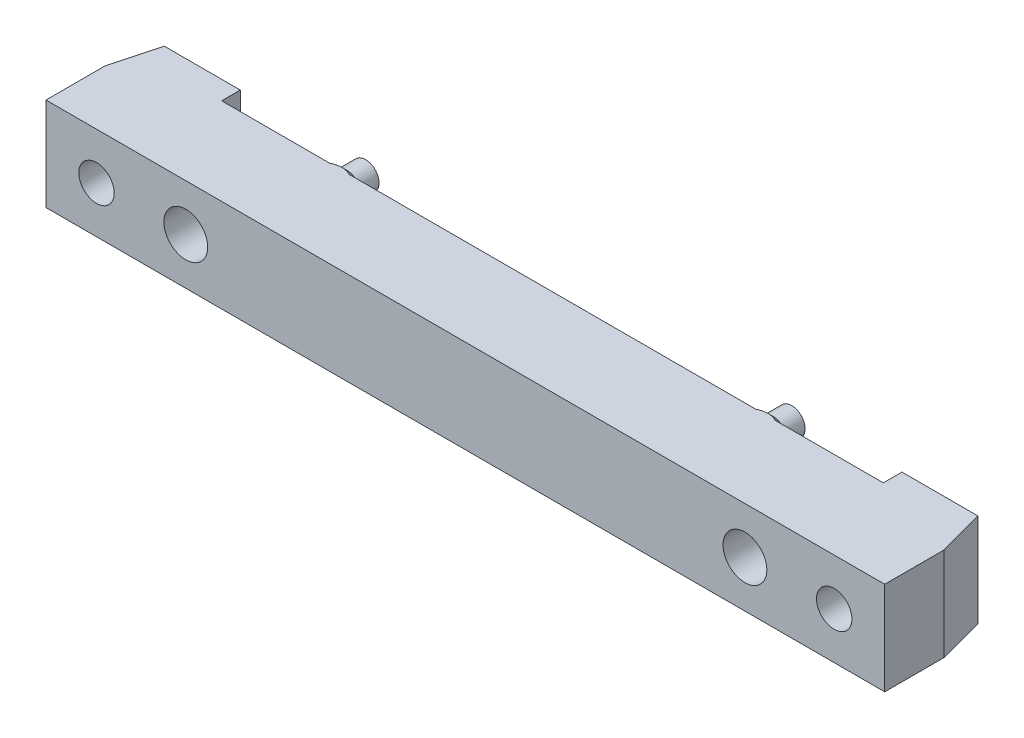
ISO-10303-21;
HEADER;
FILE_DESCRIPTION(('STEP AP214'),'2;1');
FILE_NAME('part.step','',(''),(''),'','','');
FILE_SCHEMA(('AUTOMOTIVE_DESIGN { 1 0 10303 214 1 1 1 1 }'));
ENDSEC;
DATA;
#1=APPLICATION_CONTEXT('core data for automotive mechanical design processes');
#2=APPLICATION_PROTOCOL_DEFINITION('international standard','automotive_design',2000,#1);
#3=PRODUCT_CONTEXT('',#1,'mechanical');
#4=PRODUCT('Part','Part','',(#3));
#5=PRODUCT_RELATED_PRODUCT_CATEGORY('part','',(#4));
#6=PRODUCT_DEFINITION_FORMATION('','',#4);
#7=PRODUCT_DEFINITION_CONTEXT('part definition',#1,'design');
#8=PRODUCT_DEFINITION('design','',#6,#7);
#9=PRODUCT_DEFINITION_SHAPE('','',#8);
#10=(LENGTH_UNIT() NAMED_UNIT(*) SI_UNIT(.MILLI.,.METRE.));
#11=(NAMED_UNIT(*) PLANE_ANGLE_UNIT() SI_UNIT($,.RADIAN.));
#12=(NAMED_UNIT(*) SI_UNIT($,.STERADIAN.) SOLID_ANGLE_UNIT());
#13=UNCERTAINTY_MEASURE_WITH_UNIT(LENGTH_MEASURE(1.E-05),#10,'distance_accuracy_value','');
#14=(GEOMETRIC_REPRESENTATION_CONTEXT(3) GLOBAL_UNCERTAINTY_ASSIGNED_CONTEXT((#13)) GLOBAL_UNIT_ASSIGNED_CONTEXT((#10,
#11,#12)) REPRESENTATION_CONTEXT('',''));
#15=CARTESIAN_POINT('',(0.,0.,0.));
#16=DIRECTION('',(0.,0.,1.));
#17=DIRECTION('',(1.,0.,0.));
#18=AXIS2_PLACEMENT_3D('',#15,#16,#17);
#19=CARTESIAN_POINT('',(0.,0.,0.));
#20=DIRECTION('',(0.,0.,1.));
#21=DIRECTION('',(1.,0.,0.));
#22=AXIS2_PLACEMENT_3D('',#19,#20,#21);
#23=PLANE('',#22);
#24=CARTESIAN_POINT('',(75.,5.,0.));
#25=DIRECTION('',(0.,0.,1.));
#26=DIRECTION('',(1.,0.,0.));
#27=AXIS2_PLACEMENT_3D('',#24,#25,#26);
#28=CIRCLE('',#27,1.89864999999999);
#29=CARTESIAN_POINT('',(76.89865,5.,0.));
#30=VERTEX_POINT('',#29);
#31=EDGE_CURVE('E333',#30,#30,#28,.T.);
#32=ORIENTED_EDGE('',*,*,#31,.T.);
#33=EDGE_LOOP('',(#32));
#34=FACE_BOUND('',#33,.T.);
#35=CARTESIAN_POINT('',(15.,5.,0.));
#36=DIRECTION('',(0.,0.,1.));
#37=DIRECTION('',(1.,0.,0.));
#38=AXIS2_PLACEMENT_3D('',#35,#36,#37);
#39=CIRCLE('',#38,1.89864999999999);
#40=CARTESIAN_POINT('',(16.89865,5.,0.));
#41=VERTEX_POINT('',#40);
#42=EDGE_CURVE('E337',#41,#41,#39,.T.);
#43=ORIENTED_EDGE('',*,*,#42,.T.);
#44=EDGE_LOOP('',(#43));
#45=FACE_BOUND('',#44,.T.);
#46=DIRECTION('',(-1.,0.,0.));
#47=VECTOR('',#46,1.);
#48=CARTESIAN_POINT('',(0.,10.,0.));
#49=LINE('',#48,#47);
#50=CARTESIAN_POINT('',(21.0843218674473,10.,0.));
#51=VERTEX_POINT('',#50);
#52=CARTESIAN_POINT('',(9.49999999999999,10.,0.));
#53=VERTEX_POINT('',#52);
#54=EDGE_CURVE('E157',#51,#53,#49,.T.);
#55=ORIENTED_EDGE('',*,*,#54,.F.);
#56=CARTESIAN_POINT('',(22.1434063877496,8.01484509953101,0.));
#57=DIRECTION('',(0.,0.,1.));
#58=DIRECTION('',(1.,0.,0.));
#59=AXIS2_PLACEMENT_3D('',#56,#57,#58);
#60=CIRCLE('',#59,2.24999999999997);
#61=CARTESIAN_POINT('',(23.2024909080518,10.,0.));
#62=VERTEX_POINT('',#61);
#63=EDGE_CURVE('E184',#51,#62,#60,.T.);
#64=ORIENTED_EDGE('',*,*,#63,.T.);
#65=CARTESIAN_POINT('',(66.8043218674473,10.,0.));
#66=VERTEX_POINT('',#65);
#67=EDGE_CURVE('E160',#66,#62,#49,.T.);
#68=ORIENTED_EDGE('',*,*,#67,.F.);
#69=CARTESIAN_POINT('',(67.8634063877496,8.01484509953101,0.));
#70=DIRECTION('',(0.,0.,1.));
#71=DIRECTION('',(1.,0.,0.));
#72=AXIS2_PLACEMENT_3D('',#69,#70,#71);
#73=CIRCLE('',#72,2.25);
#74=CARTESIAN_POINT('',(68.9224909080519,10.,0.));
#75=VERTEX_POINT('',#74);
#76=EDGE_CURVE('E182',#66,#75,#73,.T.);
#77=ORIENTED_EDGE('',*,*,#76,.T.);
#78=CARTESIAN_POINT('',(80.5,10.,0.));
#79=VERTEX_POINT('',#78);
#80=EDGE_CURVE('E147',#79,#75,#49,.T.);
#81=ORIENTED_EDGE('',*,*,#80,.F.);
#82=DIRECTION('',(0.,1.,0.));
#83=VECTOR('',#82,1.);
#84=CARTESIAN_POINT('',(80.5,10.,0.));
#85=LINE('',#84,#83);
#86=CARTESIAN_POINT('',(80.5,0.,0.));
#87=VERTEX_POINT('',#86);
#88=EDGE_CURVE('E133',#87,#79,#85,.T.);
#89=ORIENTED_EDGE('',*,*,#88,.F.);
#90=DIRECTION('',(1.,0.,0.));
#91=VECTOR('',#90,1.);
#92=CARTESIAN_POINT('',(0.,0.,0.));
#93=LINE('',#92,#91);
#94=CARTESIAN_POINT('',(9.49999999999999,0.,0.));
#95=VERTEX_POINT('',#94);
#96=EDGE_CURVE('E143',#95,#87,#93,.T.);
#97=ORIENTED_EDGE('',*,*,#96,.F.);
#98=DIRECTION('',(0.,-1.,0.));
#99=VECTOR('',#98,1.);
#100=CARTESIAN_POINT('',(9.49999999999999,10.,0.));
#101=LINE('',#100,#99);
#102=EDGE_CURVE('E148',#53,#95,#101,.T.);
#103=ORIENTED_EDGE('',*,*,#102,.F.);
#104=EDGE_LOOP('',(#55,#64,#68,#77,#81,#89,#97,#103));
#105=FACE_BOUND('',#104,.T.);
#106=ADVANCED_FACE('F38',(#34,#45,#105),#23,.F.);
#107=CARTESIAN_POINT('',(0.,10.,9.35));
#108=DIRECTION('',(1.,0.,0.));
#109=DIRECTION('',(0.,0.,-1.));
#110=AXIS2_PLACEMENT_3D('',#107,#108,#109);
#111=PLANE('',#110);
#112=DIRECTION('',(0.,0.,-1.));
#113=VECTOR('',#112,1.);
#114=CARTESIAN_POINT('',(0.,10.,9.35));
#115=LINE('',#114,#113);
#116=CARTESIAN_POINT('',(0.,10.,9.35));
#117=VERTEX_POINT('',#116);
#118=CARTESIAN_POINT('',(0.,10.,3.00000000000006));
#119=VERTEX_POINT('',#118);
#120=EDGE_CURVE('E169',#117,#119,#115,.T.);
#121=ORIENTED_EDGE('',*,*,#120,.T.);
#122=DIRECTION('',(0.,-1.,0.));
#123=VECTOR('',#122,1.);
#124=CARTESIAN_POINT('',(0.,10.,3.00000000000006));
#125=LINE('',#124,#123);
#126=CARTESIAN_POINT('',(0.,0.,3.00000000000006));
#127=VERTEX_POINT('',#126);
#128=EDGE_CURVE('E414',#119,#127,#125,.T.);
#129=ORIENTED_EDGE('',*,*,#128,.T.);
#130=DIRECTION('',(0.,0.,-1.));
#131=VECTOR('',#130,1.);
#132=CARTESIAN_POINT('',(0.,0.,9.35));
#133=LINE('',#132,#131);
#134=CARTESIAN_POINT('',(0.,0.,9.35));
#135=VERTEX_POINT('',#134);
#136=EDGE_CURVE('E177',#135,#127,#133,.T.);
#137=ORIENTED_EDGE('',*,*,#136,.F.);
#138=DIRECTION('',(0.,-1.,0.));
#139=VECTOR('',#138,1.);
#140=CARTESIAN_POINT('',(0.,10.,9.35));
#141=LINE('',#140,#139);
#142=EDGE_CURVE('E168',#117,#135,#141,.T.);
#143=ORIENTED_EDGE('',*,*,#142,.F.);
#144=EDGE_LOOP('',(#121,#129,#137,#143));
#145=FACE_BOUND('',#144,.T.);
#146=ADVANCED_FACE('F220',(#145),#111,.F.);
#147=CARTESIAN_POINT('',(0.,0.,9.35));
#148=DIRECTION('',(0.,1.,0.));
#149=DIRECTION('',(0.,0.,1.));
#150=AXIS2_PLACEMENT_3D('',#147,#148,#149);
#151=PLANE('',#150);
#152=ORIENTED_EDGE('',*,*,#136,.T.);
#153=DIRECTION('',(-0.258819045102518,0.,0.965925826289069));
#154=VECTOR('',#153,1.);
#155=CARTESIAN_POINT('',(1.33974596215562,0.,-2.));
#156=LINE('',#155,#154);
#157=CARTESIAN_POINT('',(1.33974596215562,0.,-2.));
#158=VERTEX_POINT('',#157);
#159=EDGE_CURVE('E415',#127,#158,#156,.F.);
#160=ORIENTED_EDGE('',*,*,#159,.T.);
#161=DIRECTION('',(-1.,0.,0.));
#162=VECTOR('',#161,1.);
#163=CARTESIAN_POINT('',(0.,0.,-2.));
#164=LINE('',#163,#162);
#165=CARTESIAN_POINT('',(9.49999999999999,0.,-2.));
#166=VERTEX_POINT('',#165);
#167=EDGE_CURVE('E394',#166,#158,#164,.T.);
#168=ORIENTED_EDGE('',*,*,#167,.F.);
#169=DIRECTION('',(0.,0.,1.));
#170=VECTOR('',#169,1.);
#171=CARTESIAN_POINT('',(9.49999999999999,0.,-2.));
#172=LINE('',#171,#170);
#173=EDGE_CURVE('E156',#166,#95,#172,.T.);
#174=ORIENTED_EDGE('',*,*,#173,.T.);
#175=ORIENTED_EDGE('',*,*,#96,.T.);
#176=DIRECTION('',(0.,0.,1.));
#177=VECTOR('',#176,1.);
#178=CARTESIAN_POINT('',(80.5,0.,-2.));
#179=LINE('',#178,#177);
#180=CARTESIAN_POINT('',(80.5,0.,-2.));
#181=VERTEX_POINT('',#180);
#182=EDGE_CURVE('E129',#181,#87,#179,.T.);
#183=ORIENTED_EDGE('',*,*,#182,.F.);
#184=DIRECTION('',(-1.,0.,0.));
#185=VECTOR('',#184,1.);
#186=CARTESIAN_POINT('',(90.,0.,-2.));
#187=LINE('',#186,#185);
#188=CARTESIAN_POINT('',(88.6602540378444,0.,-2.));
#189=VERTEX_POINT('',#188);
#190=EDGE_CURVE('E149',#189,#181,#187,.T.);
#191=ORIENTED_EDGE('',*,*,#190,.F.);
#192=DIRECTION('',(0.258819045102519,0.,0.965925826289069));
#193=VECTOR('',#192,1.);
#194=CARTESIAN_POINT('',(88.6602540378444,0.,-2.));
#195=LINE('',#194,#193);
#196=CARTESIAN_POINT('',(90.,0.,3.00000000000006));
#197=VERTEX_POINT('',#196);
#198=EDGE_CURVE('E54',#189,#197,#195,.T.);
#199=ORIENTED_EDGE('',*,*,#198,.T.);
#200=DIRECTION('',(0.,0.,-1.));
#201=VECTOR('',#200,1.);
#202=CARTESIAN_POINT('',(90.,0.,9.35));
#203=LINE('',#202,#201);
#204=CARTESIAN_POINT('',(90.,0.,9.35));
#205=VERTEX_POINT('',#204);
#206=EDGE_CURVE('E175',#205,#197,#203,.T.);
#207=ORIENTED_EDGE('',*,*,#206,.F.);
#208=DIRECTION('',(1.,0.,0.));
#209=VECTOR('',#208,1.);
#210=CARTESIAN_POINT('',(0.,0.,9.35));
#211=LINE('',#210,#209);
#212=EDGE_CURVE('E401',#135,#205,#211,.T.);
#213=ORIENTED_EDGE('',*,*,#212,.F.);
#214=EDGE_LOOP('',(#152,#160,#168,#174,#175,#183,#191,#199,#207,#213));
#215=FACE_BOUND('',#214,.T.);
#216=ADVANCED_FACE('F153',(#215),#151,.F.);
#217=CARTESIAN_POINT('',(90.,10.,9.35));
#218=DIRECTION('',(-1.,0.,0.));
#219=DIRECTION('',(0.,0.,1.));
#220=AXIS2_PLACEMENT_3D('',#217,#218,#219);
#221=PLANE('',#220);
#222=ORIENTED_EDGE('',*,*,#206,.T.);
#223=DIRECTION('',(0.,1.,0.));
#224=VECTOR('',#223,1.);
#225=CARTESIAN_POINT('',(90.,10.,3.00000000000006));
#226=LINE('',#225,#224);
#227=CARTESIAN_POINT('',(90.,10.,3.00000000000006));
#228=VERTEX_POINT('',#227);
#229=EDGE_CURVE('E11',#197,#228,#226,.T.);
#230=ORIENTED_EDGE('',*,*,#229,.T.);
#231=DIRECTION('',(0.,0.,-1.));
#232=VECTOR('',#231,1.);
#233=CARTESIAN_POINT('',(90.,10.,9.35));
#234=LINE('',#233,#232);
#235=CARTESIAN_POINT('',(90.,10.,9.35));
#236=VERTEX_POINT('',#235);
#237=EDGE_CURVE('E172',#236,#228,#234,.T.);
#238=ORIENTED_EDGE('',*,*,#237,.F.);
#239=DIRECTION('',(0.,1.,0.));
#240=VECTOR('',#239,1.);
#241=CARTESIAN_POINT('',(90.,10.,9.35));
#242=LINE('',#241,#240);
#243=EDGE_CURVE('E402',#205,#236,#242,.T.);
#244=ORIENTED_EDGE('',*,*,#243,.F.);
#245=EDGE_LOOP('',(#222,#230,#238,#244));
#246=FACE_BOUND('',#245,.T.);
#247=ADVANCED_FACE('F444',(#246),#221,.F.);
#248=CARTESIAN_POINT('',(0.,10.,9.35));
#249=DIRECTION('',(0.,-1.,0.));
#250=DIRECTION('',(0.,0.,-1.));
#251=AXIS2_PLACEMENT_3D('',#248,#249,#250);
#252=PLANE('',#251);
#253=DIRECTION('',(1.,0.,0.));
#254=VECTOR('',#253,1.);
#255=CARTESIAN_POINT('',(0.,10.,-2.));
#256=LINE('',#255,#254);
#257=CARTESIAN_POINT('',(1.33974596215562,10.,-2.));
#258=VERTEX_POINT('',#257);
#259=CARTESIAN_POINT('',(9.49999999999999,10.,-2.));
#260=VERTEX_POINT('',#259);
#261=EDGE_CURVE('E390',#258,#260,#256,.T.);
#262=ORIENTED_EDGE('',*,*,#261,.F.);
#263=DIRECTION('',(0.258819045102518,0.,-0.965925826289069));
#264=VECTOR('',#263,1.);
#265=CARTESIAN_POINT('',(1.33974596215562,10.,-2.));
#266=LINE('',#265,#264);
#267=EDGE_CURVE('E412',#258,#119,#266,.F.);
#268=ORIENTED_EDGE('',*,*,#267,.T.);
#269=ORIENTED_EDGE('',*,*,#120,.F.);
#270=DIRECTION('',(-1.,0.,0.));
#271=VECTOR('',#270,1.);
#272=CARTESIAN_POINT('',(0.,10.,9.35));
#273=LINE('',#272,#271);
#274=EDGE_CURVE('E165',#236,#117,#273,.T.);
#275=ORIENTED_EDGE('',*,*,#274,.F.);
#276=ORIENTED_EDGE('',*,*,#237,.T.);
#277=DIRECTION('',(-0.258819045102519,0.,-0.965925826289069));
#278=VECTOR('',#277,1.);
#279=CARTESIAN_POINT('',(88.6602540378444,10.,-2.));
#280=LINE('',#279,#278);
#281=CARTESIAN_POINT('',(88.6602540378444,10.,-2.));
#282=VERTEX_POINT('',#281);
#283=EDGE_CURVE('E424',#228,#282,#280,.T.);
#284=ORIENTED_EDGE('',*,*,#283,.T.);
#285=DIRECTION('',(1.,0.,0.));
#286=VECTOR('',#285,1.);
#287=CARTESIAN_POINT('',(90.,10.,-2.));
#288=LINE('',#287,#286);
#289=CARTESIAN_POINT('',(80.5,10.,-2.));
#290=VERTEX_POINT('',#289);
#291=EDGE_CURVE('E384',#290,#282,#288,.T.);
#292=ORIENTED_EDGE('',*,*,#291,.F.);
#293=DIRECTION('',(0.,0.,1.));
#294=VECTOR('',#293,1.);
#295=CARTESIAN_POINT('',(80.5,10.,-2.));
#296=LINE('',#295,#294);
#297=EDGE_CURVE('E137',#290,#79,#296,.T.);
#298=ORIENTED_EDGE('',*,*,#297,.T.);
#299=ORIENTED_EDGE('',*,*,#80,.T.);
#300=CARTESIAN_POINT('',(68.9224909080519,10.,0.));
#301=CARTESIAN_POINT('',(68.8486025928533,10.,-0.0347613333163118));
#302=CARTESIAN_POINT('',(68.7735302693326,10.,-0.0672845176782767));
#303=CARTESIAN_POINT('',(68.6207273466369,10.,-0.126472117151315));
#304=CARTESIAN_POINT('',(68.5429859962743,10.,-0.153108543440178));
#305=CARTESIAN_POINT('',(68.3862953466723,10.,-0.198483431659259));
#306=CARTESIAN_POINT('',(68.3073759590195,10.,-0.217322431370378));
#307=CARTESIAN_POINT('',(68.14804040387,10.,-0.246067233123785));
#308=CARTESIAN_POINT('',(68.0676275552875,10.,-0.25599087348665));
#309=CARTESIAN_POINT('',(67.9248824200154,10.,-0.264861668772567));
#310=CARTESIAN_POINT('',(67.8626707202391,10.,-0.265816959579119));
#311=CARTESIAN_POINT('',(67.7384104192791,10.,-0.261882905564298));
#312=CARTESIAN_POINT('',(67.6763618788641,10.,-0.256991627008138));
#313=CARTESIAN_POINT('',(67.5529345910555,10.,-0.24164830624512));
#314=CARTESIAN_POINT('',(67.4915562313416,10.,-0.231193203155666));
#315=CARTESIAN_POINT('',(67.3698565027936,10.,-0.205276663475506));
#316=CARTESIAN_POINT('',(67.3095355475518,10.,-0.189813312073332));
#317=CARTESIAN_POINT('',(67.1733084652748,10.,-0.149591267174614));
#318=CARTESIAN_POINT('',(67.0978192898175,10.,-0.123440538960132));
#319=CARTESIAN_POINT('',(66.9492900449546,10.,-0.0655545423802932));
#320=CARTESIAN_POINT('',(66.876242552406,10.,-0.0338384710550207));
#321=CARTESIAN_POINT('',(66.8043218674473,10.,0.));
#322=B_SPLINE_CURVE_WITH_KNOTS('',3,(#300,#301,#302,#303,#304,#305,#306,#307,#308,#309,#310,
#311,#312,#313,#314,#315,#316,#317,#318,#319,#320,#321),.UNSPECIFIED.,.F.,.F.,(4,2,2,2,2,2,2,2,
2,2,4),(0.,0.245112637165776,0.49136673135872,0.734338569783898,0.976823167586525,
1.16321399633482,1.34966649033706,1.53622166552116,1.72284825100505,1.96225504114346,
2.20085169980036),.UNSPECIFIED.);
#323=EDGE_CURVE('E198',#75,#66,#322,.T.);
#324=ORIENTED_EDGE('',*,*,#323,.T.);
#325=ORIENTED_EDGE('',*,*,#67,.T.);
#326=CARTESIAN_POINT('',(23.2024909080518,10.,0.));
#327=CARTESIAN_POINT('',(23.1286025928533,10.,-0.0347613333163101));
#328=CARTESIAN_POINT('',(23.0535302693326,10.,-0.0672845176782733));
#329=CARTESIAN_POINT('',(22.9007273466368,10.,-0.126472117151307));
#330=CARTESIAN_POINT('',(22.8229859962742,10.,-0.153108543440166));
#331=CARTESIAN_POINT('',(22.6662953466723,10.,-0.198483431659244));
#332=CARTESIAN_POINT('',(22.5873759590194,10.,-0.217322431370363));
#333=CARTESIAN_POINT('',(22.42804040387,10.,-0.246067233123765));
#334=CARTESIAN_POINT('',(22.3476275552874,10.,-0.255990873486627));
#335=CARTESIAN_POINT('',(22.2048824200153,10.,-0.26486166877254));
#336=CARTESIAN_POINT('',(22.142670720239,10.,-0.265816959579092));
#337=CARTESIAN_POINT('',(22.018410419279,10.,-0.261882905564267));
#338=CARTESIAN_POINT('',(21.956361878864,10.,-0.256991627008105));
#339=CARTESIAN_POINT('',(21.8329345910555,10.,-0.241648306245086));
#340=CARTESIAN_POINT('',(21.7715562313416,10.,-0.231193203155633));
#341=CARTESIAN_POINT('',(21.6498565027936,10.,-0.205276663475472));
#342=CARTESIAN_POINT('',(21.5895355475518,10.,-0.189813312073295));
#343=CARTESIAN_POINT('',(21.4533084652748,10.,-0.149591267174578));
#344=CARTESIAN_POINT('',(21.3778192898175,10.,-0.123440538960099));
#345=CARTESIAN_POINT('',(21.2292900449546,10.,-0.0655545423802722));
#346=CARTESIAN_POINT('',(21.156242552406,10.,-0.0338384710550077));
#347=CARTESIAN_POINT('',(21.0843218674473,10.,0.));
#348=B_SPLINE_CURVE_WITH_KNOTS('',3,(#326,#327,#328,#329,#330,#331,#332,#333,#334,#335,#336,
#337,#338,#339,#340,#341,#342,#343,#344,#345,#346,#347),.UNSPECIFIED.,.F.,.F.,(4,2,2,2,2,2,2,2,
2,2,4),(0.,0.24511263716578,0.491366731358712,0.734338569783899,0.976823167586497,
1.16321399633481,1.34966649033705,1.53622166552112,1.72284825100503,1.96225504114339,
2.20085169980024),.UNSPECIFIED.);
#349=EDGE_CURVE('E190',#62,#51,#348,.T.);
#350=ORIENTED_EDGE('',*,*,#349,.T.);
#351=ORIENTED_EDGE('',*,*,#54,.T.);
#352=DIRECTION('',(0.,0.,1.));
#353=VECTOR('',#352,1.);
#354=CARTESIAN_POINT('',(9.49999999999999,10.,-2.));
#355=LINE('',#354,#353);
#356=EDGE_CURVE('E158',#260,#53,#355,.T.);
#357=ORIENTED_EDGE('',*,*,#356,.F.);
#358=EDGE_LOOP('',(#262,#268,#269,#275,#276,#284,#292,#298,#299,#324,#325,#350,#351,#357));
#359=FACE_BOUND('',#358,.T.);
#360=ADVANCED_FACE('F205',(#359),#252,.F.);
#361=CARTESIAN_POINT('',(0.,0.,9.35));
#362=DIRECTION('',(0.,0.,1.));
#363=DIRECTION('',(1.,0.,0.));
#364=AXIS2_PLACEMENT_3D('',#361,#362,#363);
#365=PLANE('',#364);
#366=CARTESIAN_POINT('',(75.,5.,9.35));
#367=DIRECTION('',(0.,0.,1.));
#368=DIRECTION('',(1.,0.,0.));
#369=AXIS2_PLACEMENT_3D('',#366,#367,#368);
#370=CIRCLE('',#369,2.34949999999999);
#371=CARTESIAN_POINT('',(77.3495,5.,9.35));
#372=VERTEX_POINT('',#371);
#373=EDGE_CURVE('E343',#372,#372,#370,.T.);
#374=ORIENTED_EDGE('',*,*,#373,.F.);
#375=EDGE_LOOP('',(#374));
#376=FACE_BOUND('',#375,.T.);
#377=CARTESIAN_POINT('',(15.,5.,9.35));
#378=DIRECTION('',(0.,0.,1.));
#379=DIRECTION('',(1.,0.,0.));
#380=AXIS2_PLACEMENT_3D('',#377,#378,#379);
#381=CIRCLE('',#380,2.34949999999999);
#382=CARTESIAN_POINT('',(17.3495,5.,9.35));
#383=VERTEX_POINT('',#382);
#384=EDGE_CURVE('E349',#383,#383,#381,.T.);
#385=ORIENTED_EDGE('',*,*,#384,.F.);
#386=EDGE_LOOP('',(#385));
#387=FACE_BOUND('',#386,.T.);
#388=CARTESIAN_POINT('',(84.5801270189222,5.,9.35));
#389=DIRECTION('',(0.,0.,-1.));
#390=DIRECTION('',(-1.,0.,0.));
#391=AXIS2_PLACEMENT_3D('',#388,#389,#390);
#392=CIRCLE('',#391,1.89865);
#393=CARTESIAN_POINT('',(82.6814770189222,5.,9.35));
#394=VERTEX_POINT('',#393);
#395=EDGE_CURVE('E358',#394,#394,#392,.T.);
#396=ORIENTED_EDGE('',*,*,#395,.T.);
#397=EDGE_LOOP('',(#396));
#398=FACE_BOUND('',#397,.T.);
#399=CARTESIAN_POINT('',(5.4198729810778,5.,9.35));
#400=DIRECTION('',(0.,0.,-1.));
#401=DIRECTION('',(-1.,0.,0.));
#402=AXIS2_PLACEMENT_3D('',#399,#400,#401);
#403=CIRCLE('',#402,1.89865);
#404=CARTESIAN_POINT('',(3.52122298107781,5.,9.35));
#405=VERTEX_POINT('',#404);
#406=EDGE_CURVE('E364',#405,#405,#403,.T.);
#407=ORIENTED_EDGE('',*,*,#406,.T.);
#408=EDGE_LOOP('',(#407));
#409=FACE_BOUND('',#408,.T.);
#410=ORIENTED_EDGE('',*,*,#142,.T.);
#411=ORIENTED_EDGE('',*,*,#212,.T.);
#412=ORIENTED_EDGE('',*,*,#243,.T.);
#413=ORIENTED_EDGE('',*,*,#274,.T.);
#414=EDGE_LOOP('',(#410,#411,#412,#413));
#415=FACE_BOUND('',#414,.T.);
#416=ADVANCED_FACE('F247',(#376,#387,#398,#409,#415),#365,.T.);
#417=CARTESIAN_POINT('',(9.49999999999999,10.,-2.));
#418=DIRECTION('',(-1.,0.,0.));
#419=DIRECTION('',(0.,-1.,0.));
#420=AXIS2_PLACEMENT_3D('',#417,#418,#419);
#421=PLANE('',#420);
#422=ORIENTED_EDGE('',*,*,#102,.T.);
#423=ORIENTED_EDGE('',*,*,#173,.F.);
#424=DIRECTION('',(0.,-1.,0.));
#425=VECTOR('',#424,1.);
#426=CARTESIAN_POINT('',(9.49999999999999,10.,-2.));
#427=LINE('',#426,#425);
#428=EDGE_CURVE('E392',#260,#166,#427,.T.);
#429=ORIENTED_EDGE('',*,*,#428,.F.);
#430=ORIENTED_EDGE('',*,*,#356,.T.);
#431=EDGE_LOOP('',(#422,#423,#429,#430));
#432=FACE_BOUND('',#431,.T.);
#433=ADVANCED_FACE('F250',(#432),#421,.F.);
#434=CARTESIAN_POINT('',(0.,0.,-2.));
#435=DIRECTION('',(0.,0.,1.));
#436=DIRECTION('',(1.,0.,0.));
#437=AXIS2_PLACEMENT_3D('',#434,#435,#436);
#438=PLANE('',#437);
#439=CARTESIAN_POINT('',(5.4198729810778,5.,-2.));
#440=DIRECTION('',(0.,0.,-1.));
#441=DIRECTION('',(-1.,0.,0.));
#442=AXIS2_PLACEMENT_3D('',#439,#440,#441);
#443=CIRCLE('',#442,2.34949999999999);
#444=CARTESIAN_POINT('',(3.07037298107782,5.,-2.));
#445=VERTEX_POINT('',#444);
#446=EDGE_CURVE('E373',#445,#445,#443,.T.);
#447=ORIENTED_EDGE('',*,*,#446,.F.);
#448=EDGE_LOOP('',(#447));
#449=FACE_BOUND('',#448,.T.);
#450=ORIENTED_EDGE('',*,*,#167,.T.);
#451=DIRECTION('',(0.,1.,0.));
#452=VECTOR('',#451,1.);
#453=CARTESIAN_POINT('',(1.33974596215562,0.,-2.));
#454=LINE('',#453,#452);
#455=EDGE_CURVE('E418',#158,#258,#454,.T.);
#456=ORIENTED_EDGE('',*,*,#455,.T.);
#457=ORIENTED_EDGE('',*,*,#261,.T.);
#458=ORIENTED_EDGE('',*,*,#428,.T.);
#459=EDGE_LOOP('',(#450,#456,#457,#458));
#460=FACE_BOUND('',#459,.T.);
#461=ADVANCED_FACE('F254',(#449,#460),#438,.F.);
#462=CARTESIAN_POINT('',(80.5,10.,-2.));
#463=DIRECTION('',(1.,0.,0.));
#464=DIRECTION('',(0.,0.,-1.));
#465=AXIS2_PLACEMENT_3D('',#462,#463,#464);
#466=PLANE('',#465);
#467=ORIENTED_EDGE('',*,*,#88,.T.);
#468=ORIENTED_EDGE('',*,*,#297,.F.);
#469=DIRECTION('',(0.,1.,0.));
#470=VECTOR('',#469,1.);
#471=CARTESIAN_POINT('',(80.5,10.,-2.));
#472=LINE('',#471,#470);
#473=EDGE_CURVE('E135',#181,#290,#472,.T.);
#474=ORIENTED_EDGE('',*,*,#473,.F.);
#475=ORIENTED_EDGE('',*,*,#182,.T.);
#476=EDGE_LOOP('',(#467,#468,#474,#475));
#477=FACE_BOUND('',#476,.T.);
#478=ADVANCED_FACE('F131',(#477),#466,.F.);
#479=CARTESIAN_POINT('',(0.,0.,-2.));
#480=DIRECTION('',(0.,0.,-1.));
#481=DIRECTION('',(-1.,0.,0.));
#482=AXIS2_PLACEMENT_3D('',#479,#480,#481);
#483=PLANE('',#482);
#484=CARTESIAN_POINT('',(84.5801270189222,5.,-2.));
#485=DIRECTION('',(0.,0.,-1.));
#486=DIRECTION('',(-1.,0.,0.));
#487=AXIS2_PLACEMENT_3D('',#484,#485,#486);
#488=CIRCLE('',#487,2.34949999999999);
#489=CARTESIAN_POINT('',(82.2306270189222,5.,-2.));
#490=VERTEX_POINT('',#489);
#491=EDGE_CURVE('E367',#490,#490,#488,.T.);
#492=ORIENTED_EDGE('',*,*,#491,.F.);
#493=EDGE_LOOP('',(#492));
#494=FACE_BOUND('',#493,.T.);
#495=ORIENTED_EDGE('',*,*,#291,.T.);
#496=DIRECTION('',(0.,-1.,0.));
#497=VECTOR('',#496,1.);
#498=CARTESIAN_POINT('',(88.6602540378444,0.,-2.));
#499=LINE('',#498,#497);
#500=EDGE_CURVE('E47',#282,#189,#499,.T.);
#501=ORIENTED_EDGE('',*,*,#500,.T.);
#502=ORIENTED_EDGE('',*,*,#190,.T.);
#503=ORIENTED_EDGE('',*,*,#473,.T.);
#504=EDGE_LOOP('',(#495,#501,#502,#503));
#505=FACE_BOUND('',#504,.T.);
#506=ADVANCED_FACE('F259',(#494,#505),#483,.T.);
#507=CARTESIAN_POINT('',(67.8634063877496,8.01484509953101,-2.8));
#508=DIRECTION('',(0.,0.,1.));
#509=DIRECTION('',(1.,0.,0.));
#510=AXIS2_PLACEMENT_3D('',#507,#508,#509);
#511=CYLINDRICAL_SURFACE('',#510,1.45);
#512=CARTESIAN_POINT('',(67.8634063877496,8.01484509953101,-0.800000000000014));
#513=DIRECTION('',(0.,0.,1.));
#514=DIRECTION('',(1.,0.,0.));
#515=AXIS2_PLACEMENT_3D('',#512,#513,#514);
#516=CIRCLE('',#515,1.45);
#517=CARTESIAN_POINT('',(69.3134063877496,8.01484509953101,-0.800000000000014));
#518=VERTEX_POINT('',#517);
#519=EDGE_CURVE('E187',#518,#518,#516,.F.);
#520=ORIENTED_EDGE('',*,*,#519,.T.);
#521=EDGE_LOOP('',(#520));
#522=FACE_BOUND('',#521,.T.);
#523=CARTESIAN_POINT('',(67.8634063877496,8.01484509953101,-2.8));
#524=DIRECTION('',(0.,0.,-1.));
#525=DIRECTION('',(-1.,0.,0.));
#526=AXIS2_PLACEMENT_3D('',#523,#524,#525);
#527=CIRCLE('',#526,1.45);
#528=CARTESIAN_POINT('',(66.4134063877496,8.01484509953101,-2.8));
#529=VERTEX_POINT('',#528);
#530=EDGE_CURVE('E138',#529,#529,#527,.T.);
#531=ORIENTED_EDGE('',*,*,#530,.F.);
#532=EDGE_LOOP('',(#531));
#533=FACE_BOUND('',#532,.T.);
#534=ADVANCED_FACE('F262',(#522,#533),#511,.T.);
#535=CARTESIAN_POINT('',(67.8634063877496,8.01484509953101,-2.8));
#536=DIRECTION('',(0.,0.,-1.));
#537=DIRECTION('',(-1.,0.,0.));
#538=AXIS2_PLACEMENT_3D('',#535,#536,#537);
#539=PLANE('',#538);
#540=ORIENTED_EDGE('',*,*,#530,.T.);
#541=EDGE_LOOP('',(#540));
#542=FACE_BOUND('',#541,.T.);
#543=ADVANCED_FACE('F268',(#542),#539,.T.);
#544=CARTESIAN_POINT('',(22.1434063877496,8.01484509953101,-2.8));
#545=DIRECTION('',(0.,0.,1.));
#546=DIRECTION('',(1.,0.,0.));
#547=AXIS2_PLACEMENT_3D('',#544,#545,#546);
#548=CYLINDRICAL_SURFACE('',#547,1.45);
#549=CARTESIAN_POINT('',(22.1434063877496,8.01484509953101,-0.799999999999987));
#550=DIRECTION('',(0.,0.,1.));
#551=DIRECTION('',(1.,0.,0.));
#552=AXIS2_PLACEMENT_3D('',#549,#550,#551);
#553=CIRCLE('',#552,1.45);
#554=CARTESIAN_POINT('',(23.5934063877496,8.01484509953101,-0.799999999999987));
#555=VERTEX_POINT('',#554);
#556=EDGE_CURVE('E179',#555,#555,#553,.F.);
#557=ORIENTED_EDGE('',*,*,#556,.T.);
#558=EDGE_LOOP('',(#557));
#559=FACE_BOUND('',#558,.T.);
#560=CARTESIAN_POINT('',(22.1434063877496,8.01484509953101,-2.8));
#561=DIRECTION('',(0.,0.,-1.));
#562=DIRECTION('',(-1.,0.,0.));
#563=AXIS2_PLACEMENT_3D('',#560,#561,#562);
#564=CIRCLE('',#563,1.45);
#565=CARTESIAN_POINT('',(20.6934063877496,8.01484509953101,-2.8));
#566=VERTEX_POINT('',#565);
#567=EDGE_CURVE('E379',#566,#566,#564,.T.);
#568=ORIENTED_EDGE('',*,*,#567,.F.);
#569=EDGE_LOOP('',(#568));
#570=FACE_BOUND('',#569,.T.);
#571=ADVANCED_FACE('F272',(#559,#570),#548,.T.);
#572=CARTESIAN_POINT('',(22.1434063877496,8.01484509953101,-2.8));
#573=DIRECTION('',(0.,0.,-1.));
#574=DIRECTION('',(-1.,0.,0.));
#575=AXIS2_PLACEMENT_3D('',#572,#573,#574);
#576=PLANE('',#575);
#577=ORIENTED_EDGE('',*,*,#567,.T.);
#578=EDGE_LOOP('',(#577));
#579=FACE_BOUND('',#578,.T.);
#580=ADVANCED_FACE('F218',(#579),#576,.T.);
#581=CARTESIAN_POINT('',(22.1434063877496,8.01484509953101,-0.799999999999987));
#582=DIRECTION('',(0.,0.,1.));
#583=DIRECTION('',(1.,0.,0.));
#584=AXIS2_PLACEMENT_3D('',#581,#582,#583);
#585=CONICAL_SURFACE('',#584,1.45,0.785398163397441);
#586=ORIENTED_EDGE('',*,*,#349,.F.);
#587=ORIENTED_EDGE('',*,*,#63,.F.);
#588=EDGE_LOOP('',(#586,#587));
#589=FACE_BOUND('',#588,.T.);
#590=ORIENTED_EDGE('',*,*,#556,.F.);
#591=EDGE_LOOP('',(#590));
#592=FACE_BOUND('',#591,.T.);
#593=ADVANCED_FACE('F210',(#589,#592),#585,.T.);
#594=CARTESIAN_POINT('',(67.8634063877496,8.01484509953101,-0.800000000000014));
#595=DIRECTION('',(0.,0.,1.));
#596=DIRECTION('',(1.,0.,0.));
#597=AXIS2_PLACEMENT_3D('',#594,#595,#596);
#598=CONICAL_SURFACE('',#597,1.45,0.785398163397441);
#599=ORIENTED_EDGE('',*,*,#323,.F.);
#600=ORIENTED_EDGE('',*,*,#76,.F.);
#601=EDGE_LOOP('',(#599,#600));
#602=FACE_BOUND('',#601,.T.);
#603=ORIENTED_EDGE('',*,*,#519,.F.);
#604=EDGE_LOOP('',(#603));
#605=FACE_BOUND('',#604,.T.);
#606=ADVANCED_FACE('F217',(#602,#605),#598,.T.);
#607=CARTESIAN_POINT('',(1.33974596215562,0.,-2.));
#608=DIRECTION('',(0.965925826289069,0.,0.258819045102518));
#609=DIRECTION('',(0.,1.,0.));
#610=AXIS2_PLACEMENT_3D('',#607,#608,#609);
#611=PLANE('',#610);
#612=ORIENTED_EDGE('',*,*,#159,.F.);
#613=ORIENTED_EDGE('',*,*,#128,.F.);
#614=ORIENTED_EDGE('',*,*,#267,.F.);
#615=ORIENTED_EDGE('',*,*,#455,.F.);
#616=EDGE_LOOP('',(#612,#613,#614,#615));
#617=FACE_BOUND('',#616,.T.);
#618=ADVANCED_FACE('F227',(#617),#611,.F.);
#619=CARTESIAN_POINT('',(88.6602540378444,0.,-2.));
#620=DIRECTION('',(0.965925826289069,0.,-0.258819045102519));
#621=DIRECTION('',(0.,1.,0.));
#622=AXIS2_PLACEMENT_3D('',#619,#620,#621);
#623=PLANE('',#622);
#624=ORIENTED_EDGE('',*,*,#283,.F.);
#625=ORIENTED_EDGE('',*,*,#229,.F.);
#626=ORIENTED_EDGE('',*,*,#198,.F.);
#627=ORIENTED_EDGE('',*,*,#500,.F.);
#628=EDGE_LOOP('',(#624,#625,#626,#627));
#629=FACE_BOUND('',#628,.T.);
#630=ADVANCED_FACE('F41',(#629),#623,.T.);
#631=CARTESIAN_POINT('',(5.4198729810778,5.,4.35));
#632=DIRECTION('',(0.,0.,1.));
#633=DIRECTION('',(1.,0.,0.));
#634=AXIS2_PLACEMENT_3D('',#631,#632,#633);
#635=PLANE('',#634);
#636=CARTESIAN_POINT('',(5.4198729810778,5.,4.35));
#637=DIRECTION('',(0.,0.,-1.));
#638=DIRECTION('',(-1.,0.,0.));
#639=AXIS2_PLACEMENT_3D('',#636,#637,#638);
#640=CIRCLE('',#639,1.89864999999999);
#641=CARTESIAN_POINT('',(3.52122298107782,5.,4.35));
#642=VERTEX_POINT('',#641);
#643=EDGE_CURVE('E361',#642,#642,#640,.T.);
#644=ORIENTED_EDGE('',*,*,#643,.F.);
#645=EDGE_LOOP('',(#644));
#646=FACE_BOUND('',#645,.T.);
#647=CARTESIAN_POINT('',(5.4198729810778,5.,4.35));
#648=DIRECTION('',(0.,0.,-1.));
#649=DIRECTION('',(-1.,0.,0.));
#650=AXIS2_PLACEMENT_3D('',#647,#648,#649);
#651=CIRCLE('',#650,2.3495);
#652=CARTESIAN_POINT('',(3.07037298107781,5.,4.35));
#653=VERTEX_POINT('',#652);
#654=EDGE_CURVE('E376',#653,#653,#651,.T.);
#655=ORIENTED_EDGE('',*,*,#654,.T.);
#656=EDGE_LOOP('',(#655));
#657=FACE_BOUND('',#656,.T.);
#658=ADVANCED_FACE('F236',(#646,#657),#635,.F.);
#659=CARTESIAN_POINT('',(5.4198729810778,5.,-2.));
#660=DIRECTION('',(0.,0.,-1.));
#661=DIRECTION('',(-1.,0.,0.));
#662=AXIS2_PLACEMENT_3D('',#659,#660,#661);
#663=CYLINDRICAL_SURFACE('',#662,2.34949999999999);
#664=ORIENTED_EDGE('',*,*,#654,.F.);
#665=EDGE_LOOP('',(#664));
#666=FACE_BOUND('',#665,.T.);
#667=ORIENTED_EDGE('',*,*,#446,.T.);
#668=EDGE_LOOP('',(#667));
#669=FACE_BOUND('',#668,.T.);
#670=ADVANCED_FACE('F282',(#666,#669),#663,.F.);
#671=CARTESIAN_POINT('',(84.5801270189222,5.,4.35));
#672=DIRECTION('',(0.,0.,1.));
#673=DIRECTION('',(1.,0.,0.));
#674=AXIS2_PLACEMENT_3D('',#671,#672,#673);
#675=PLANE('',#674);
#676=CARTESIAN_POINT('',(84.5801270189222,5.,4.35));
#677=DIRECTION('',(0.,0.,-1.));
#678=DIRECTION('',(-1.,0.,0.));
#679=AXIS2_PLACEMENT_3D('',#676,#677,#678);
#680=CIRCLE('',#679,1.89864999999999);
#681=CARTESIAN_POINT('',(82.6814770189222,5.,4.35));
#682=VERTEX_POINT('',#681);
#683=EDGE_CURVE('E355',#682,#682,#680,.T.);
#684=ORIENTED_EDGE('',*,*,#683,.F.);
#685=EDGE_LOOP('',(#684));
#686=FACE_BOUND('',#685,.T.);
#687=CARTESIAN_POINT('',(84.5801270189222,5.,4.35));
#688=DIRECTION('',(0.,0.,-1.));
#689=DIRECTION('',(-1.,0.,0.));
#690=AXIS2_PLACEMENT_3D('',#687,#688,#689);
#691=CIRCLE('',#690,2.3495);
#692=CARTESIAN_POINT('',(82.2306270189222,5.,4.35));
#693=VERTEX_POINT('',#692);
#694=EDGE_CURVE('E370',#693,#693,#691,.T.);
#695=ORIENTED_EDGE('',*,*,#694,.T.);
#696=EDGE_LOOP('',(#695));
#697=FACE_BOUND('',#696,.T.);
#698=ADVANCED_FACE('F286',(#686,#697),#675,.F.);
#699=CARTESIAN_POINT('',(84.5801270189222,5.,-2.));
#700=DIRECTION('',(0.,0.,-1.));
#701=DIRECTION('',(-1.,0.,0.));
#702=AXIS2_PLACEMENT_3D('',#699,#700,#701);
#703=CYLINDRICAL_SURFACE('',#702,2.3495);
#704=ORIENTED_EDGE('',*,*,#694,.F.);
#705=EDGE_LOOP('',(#704));
#706=FACE_BOUND('',#705,.T.);
#707=ORIENTED_EDGE('',*,*,#491,.T.);
#708=EDGE_LOOP('',(#707));
#709=FACE_BOUND('',#708,.T.);
#710=ADVANCED_FACE('F290',(#706,#709),#703,.F.);
#711=CARTESIAN_POINT('',(5.4198729810778,5.,4.35));
#712=DIRECTION('',(0.,0.,-1.));
#713=DIRECTION('',(-1.,0.,0.));
#714=AXIS2_PLACEMENT_3D('',#711,#712,#713);
#715=CYLINDRICAL_SURFACE('',#714,1.89864999999999);
#716=ORIENTED_EDGE('',*,*,#406,.F.);
#717=EDGE_LOOP('',(#716));
#718=FACE_BOUND('',#717,.T.);
#719=ORIENTED_EDGE('',*,*,#643,.T.);
#720=EDGE_LOOP('',(#719));
#721=FACE_BOUND('',#720,.T.);
#722=ADVANCED_FACE('F294',(#718,#721),#715,.F.);
#723=CARTESIAN_POINT('',(84.5801270189222,5.,4.35));
#724=DIRECTION('',(0.,0.,-1.));
#725=DIRECTION('',(-1.,0.,0.));
#726=AXIS2_PLACEMENT_3D('',#723,#724,#725);
#727=CYLINDRICAL_SURFACE('',#726,1.89864999999999);
#728=ORIENTED_EDGE('',*,*,#395,.F.);
#729=EDGE_LOOP('',(#728));
#730=FACE_BOUND('',#729,.T.);
#731=ORIENTED_EDGE('',*,*,#683,.T.);
#732=EDGE_LOOP('',(#731));
#733=FACE_BOUND('',#732,.T.);
#734=ADVANCED_FACE('F298',(#730,#733),#727,.F.);
#735=CARTESIAN_POINT('',(15.,5.,3.00000000000001));
#736=DIRECTION('',(0.,0.,-1.));
#737=DIRECTION('',(-1.,0.,0.));
#738=AXIS2_PLACEMENT_3D('',#735,#736,#737);
#739=PLANE('',#738);
#740=CARTESIAN_POINT('',(15.,5.,3.00000000000001));
#741=DIRECTION('',(0.,0.,1.));
#742=DIRECTION('',(1.,0.,0.));
#743=AXIS2_PLACEMENT_3D('',#740,#741,#742);
#744=CIRCLE('',#743,1.89864999999999);
#745=CARTESIAN_POINT('',(16.89865,5.,3.00000000000001));
#746=VERTEX_POINT('',#745);
#747=EDGE_CURVE('E334',#746,#746,#744,.T.);
#748=ORIENTED_EDGE('',*,*,#747,.F.);
#749=EDGE_LOOP('',(#748));
#750=FACE_BOUND('',#749,.T.);
#751=CARTESIAN_POINT('',(15.,5.,3.00000000000001));
#752=DIRECTION('',(0.,0.,1.));
#753=DIRECTION('',(1.,0.,0.));
#754=AXIS2_PLACEMENT_3D('',#751,#752,#753);
#755=CIRCLE('',#754,2.34949999999999);
#756=CARTESIAN_POINT('',(17.3495,5.,3.00000000000001));
#757=VERTEX_POINT('',#756);
#758=EDGE_CURVE('E352',#757,#757,#755,.T.);
#759=ORIENTED_EDGE('',*,*,#758,.T.);
#760=EDGE_LOOP('',(#759));
#761=FACE_BOUND('',#760,.T.);
#762=ADVANCED_FACE('F302',(#750,#761),#739,.F.);
#763=CARTESIAN_POINT('',(15.,5.,9.35));
#764=DIRECTION('',(0.,0.,1.));
#765=DIRECTION('',(1.,0.,0.));
#766=AXIS2_PLACEMENT_3D('',#763,#764,#765);
#767=CYLINDRICAL_SURFACE('',#766,2.34949999999999);
#768=ORIENTED_EDGE('',*,*,#758,.F.);
#769=EDGE_LOOP('',(#768));
#770=FACE_BOUND('',#769,.T.);
#771=ORIENTED_EDGE('',*,*,#384,.T.);
#772=EDGE_LOOP('',(#771));
#773=FACE_BOUND('',#772,.T.);
#774=ADVANCED_FACE('F306',(#770,#773),#767,.F.);
#775=CARTESIAN_POINT('',(75.,5.,3.));
#776=DIRECTION('',(0.,0.,-1.));
#777=DIRECTION('',(-1.,0.,0.));
#778=AXIS2_PLACEMENT_3D('',#775,#776,#777);
#779=PLANE('',#778);
#780=CARTESIAN_POINT('',(75.,5.,3.));
#781=DIRECTION('',(0.,0.,1.));
#782=DIRECTION('',(1.,0.,0.));
#783=AXIS2_PLACEMENT_3D('',#780,#781,#782);
#784=CIRCLE('',#783,1.89864999999999);
#785=CARTESIAN_POINT('',(76.89865,5.,3.));
#786=VERTEX_POINT('',#785);
#787=EDGE_CURVE('E331',#786,#786,#784,.T.);
#788=ORIENTED_EDGE('',*,*,#787,.F.);
#789=EDGE_LOOP('',(#788));
#790=FACE_BOUND('',#789,.T.);
#791=CARTESIAN_POINT('',(75.,5.,3.00000000000001));
#792=DIRECTION('',(0.,0.,1.));
#793=DIRECTION('',(1.,0.,0.));
#794=AXIS2_PLACEMENT_3D('',#791,#792,#793);
#795=CIRCLE('',#794,2.34949999999999);
#796=CARTESIAN_POINT('',(77.3495,5.,3.00000000000001));
#797=VERTEX_POINT('',#796);
#798=EDGE_CURVE('E346',#797,#797,#795,.T.);
#799=ORIENTED_EDGE('',*,*,#798,.T.);
#800=EDGE_LOOP('',(#799));
#801=FACE_BOUND('',#800,.T.);
#802=ADVANCED_FACE('F310',(#790,#801),#779,.F.);
#803=CARTESIAN_POINT('',(75.,5.,9.35));
#804=DIRECTION('',(0.,0.,1.));
#805=DIRECTION('',(1.,0.,0.));
#806=AXIS2_PLACEMENT_3D('',#803,#804,#805);
#807=CYLINDRICAL_SURFACE('',#806,2.34949999999999);
#808=ORIENTED_EDGE('',*,*,#798,.F.);
#809=EDGE_LOOP('',(#808));
#810=FACE_BOUND('',#809,.T.);
#811=ORIENTED_EDGE('',*,*,#373,.T.);
#812=EDGE_LOOP('',(#811));
#813=FACE_BOUND('',#812,.T.);
#814=ADVANCED_FACE('F314',(#810,#813),#807,.F.);
#815=CARTESIAN_POINT('',(15.,5.,3.00000000000001));
#816=DIRECTION('',(0.,0.,1.));
#817=DIRECTION('',(1.,0.,0.));
#818=AXIS2_PLACEMENT_3D('',#815,#816,#817);
#819=CYLINDRICAL_SURFACE('',#818,1.89864999999999);
#820=ORIENTED_EDGE('',*,*,#747,.T.);
#821=EDGE_LOOP('',(#820));
#822=FACE_BOUND('',#821,.T.);
#823=ORIENTED_EDGE('',*,*,#42,.F.);
#824=EDGE_LOOP('',(#823));
#825=FACE_BOUND('',#824,.T.);
#826=ADVANCED_FACE('F318',(#822,#825),#819,.F.);
#827=CARTESIAN_POINT('',(75.,5.,3.));
#828=DIRECTION('',(0.,0.,1.));
#829=DIRECTION('',(1.,0.,0.));
#830=AXIS2_PLACEMENT_3D('',#827,#828,#829);
#831=CYLINDRICAL_SURFACE('',#830,1.89864999999999);
#832=ORIENTED_EDGE('',*,*,#787,.T.);
#833=EDGE_LOOP('',(#832));
#834=FACE_BOUND('',#833,.T.);
#835=ORIENTED_EDGE('',*,*,#31,.F.);
#836=EDGE_LOOP('',(#835));
#837=FACE_BOUND('',#836,.T.);
#838=ADVANCED_FACE('F322',(#834,#837),#831,.F.);
#839=CLOSED_SHELL('',(#106,#146,#216,#247,#360,#416,#433,#461,#478,#506,#534,#543,#571,#580,
#593,#606,#618,#630,#658,#670,#698,#710,#722,#734,#762,#774,#802,#814,#826,#838));
#840=MANIFOLD_SOLID_BREP('B2',#839);
#841=ADVANCED_BREP_SHAPE_REPRESENTATION('',(#18,#840),#14);
#842=SHAPE_DEFINITION_REPRESENTATION(#9,#841);
ENDSEC;
END-ISO-10303-21;
